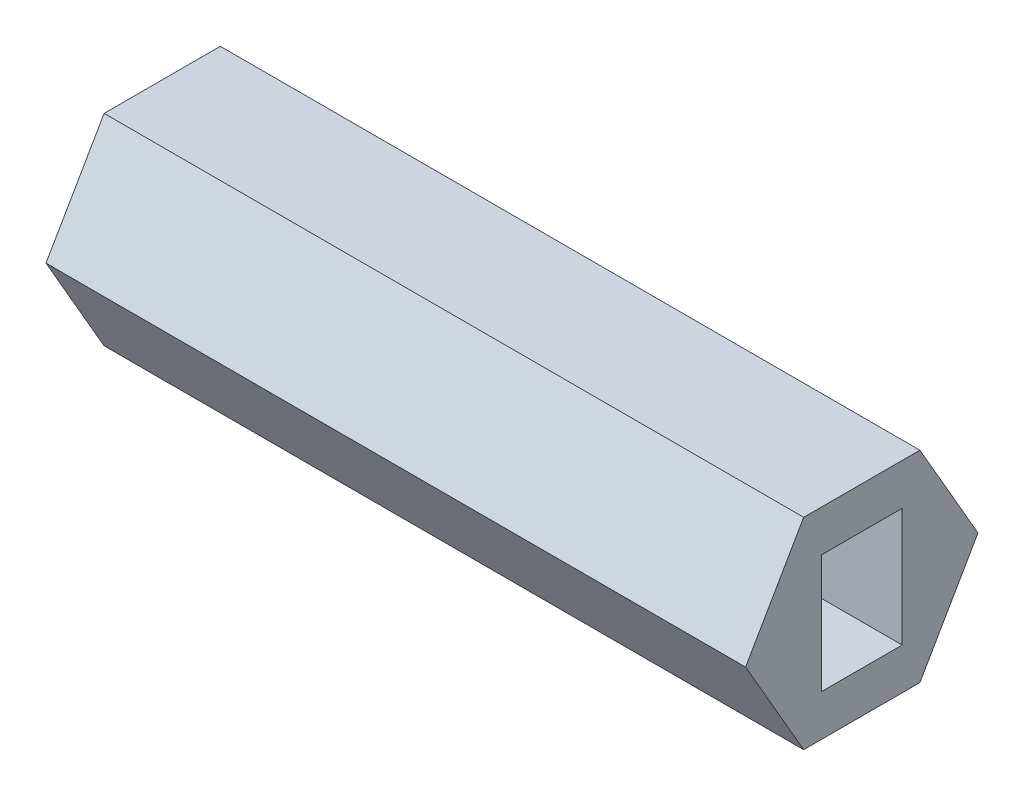
ISO-10303-21;
HEADER;
FILE_DESCRIPTION(('STEP AP214'),'2;1');
FILE_NAME('part.step','',(''),(''),'','','');
FILE_SCHEMA(('AUTOMOTIVE_DESIGN { 1 0 10303 214 1 1 1 1 }'));
ENDSEC;
DATA;
#1=APPLICATION_CONTEXT('core data for automotive mechanical design processes');
#2=APPLICATION_PROTOCOL_DEFINITION('international standard','automotive_design',2000,#1);
#3=PRODUCT_CONTEXT('',#1,'mechanical');
#4=PRODUCT('Part','Part','',(#3));
#5=PRODUCT_RELATED_PRODUCT_CATEGORY('part','',(#4));
#6=PRODUCT_DEFINITION_FORMATION('','',#4);
#7=PRODUCT_DEFINITION_CONTEXT('part definition',#1,'design');
#8=PRODUCT_DEFINITION('design','',#6,#7);
#9=PRODUCT_DEFINITION_SHAPE('','',#8);
#10=(LENGTH_UNIT() NAMED_UNIT(*) SI_UNIT(.MILLI.,.METRE.));
#11=(NAMED_UNIT(*) PLANE_ANGLE_UNIT() SI_UNIT($,.RADIAN.));
#12=(NAMED_UNIT(*) SI_UNIT($,.STERADIAN.) SOLID_ANGLE_UNIT());
#13=UNCERTAINTY_MEASURE_WITH_UNIT(LENGTH_MEASURE(1.E-05),#10,'distance_accuracy_value','');
#14=(GEOMETRIC_REPRESENTATION_CONTEXT(3) GLOBAL_UNCERTAINTY_ASSIGNED_CONTEXT((#13)) GLOBAL_UNIT_ASSIGNED_CONTEXT((#10,
#11,#12)) REPRESENTATION_CONTEXT('',''));
#15=CARTESIAN_POINT('',(0.,0.,0.));
#16=DIRECTION('',(0.,0.,1.));
#17=DIRECTION('',(1.,0.,0.));
#18=AXIS2_PLACEMENT_3D('',#15,#16,#17);
#19=CARTESIAN_POINT('',(33.02,0.,0.));
#20=DIRECTION('',(1.,0.,0.));
#21=DIRECTION('',(0.,0.,-1.));
#22=AXIS2_PLACEMENT_3D('',#19,#20,#21);
#23=PLANE('',#22);
#24=DIRECTION('',(0.,0.,1.));
#25=VECTOR('',#24,1.);
#26=CARTESIAN_POINT('',(33.02,4.75,-2.74241377865072));
#27=LINE('',#26,#25);
#28=CARTESIAN_POINT('',(33.02,4.75,-2.74241377865072));
#29=VERTEX_POINT('',#28);
#30=CARTESIAN_POINT('',(33.02,4.75,2.74241377865072));
#31=VERTEX_POINT('',#30);
#32=EDGE_CURVE('E165',#29,#31,#27,.T.);
#33=ORIENTED_EDGE('',*,*,#32,.T.);
#34=DIRECTION('',(0.,-0.866025403784438,0.5));
#35=VECTOR('',#34,1.);
#36=CARTESIAN_POINT('',(33.02,4.75,2.74241377865072));
#37=LINE('',#36,#35);
#38=CARTESIAN_POINT('',(33.02,0.,5.48482755730145));
#39=VERTEX_POINT('',#38);
#40=EDGE_CURVE('E169',#31,#39,#37,.T.);
#41=ORIENTED_EDGE('',*,*,#40,.T.);
#42=DIRECTION('',(0.,-0.866025403784439,-0.5));
#43=VECTOR('',#42,1.);
#44=CARTESIAN_POINT('',(33.02,0.,5.48482755730145));
#45=LINE('',#44,#43);
#46=CARTESIAN_POINT('',(33.02,-4.75,2.74241377865072));
#47=VERTEX_POINT('',#46);
#48=EDGE_CURVE('E173',#39,#47,#45,.T.);
#49=ORIENTED_EDGE('',*,*,#48,.T.);
#50=DIRECTION('',(0.,0.,-1.));
#51=VECTOR('',#50,1.);
#52=CARTESIAN_POINT('',(33.02,-4.75,2.74241377865072));
#53=LINE('',#52,#51);
#54=CARTESIAN_POINT('',(33.02,-4.75,-2.74241377865072));
#55=VERTEX_POINT('',#54);
#56=EDGE_CURVE('E176',#47,#55,#53,.T.);
#57=ORIENTED_EDGE('',*,*,#56,.T.);
#58=DIRECTION('',(0.,0.866025403784438,-0.5));
#59=VECTOR('',#58,1.);
#60=CARTESIAN_POINT('',(33.02,-4.75,-2.74241377865072));
#61=LINE('',#60,#59);
#62=CARTESIAN_POINT('',(33.02,0.,-5.48482755730144));
#63=VERTEX_POINT('',#62);
#64=EDGE_CURVE('E179',#55,#63,#61,.T.);
#65=ORIENTED_EDGE('',*,*,#64,.T.);
#66=DIRECTION('',(0.,0.866025403784439,0.5));
#67=VECTOR('',#66,1.);
#68=CARTESIAN_POINT('',(33.02,0.,-5.48482755730144));
#69=LINE('',#68,#67);
#70=EDGE_CURVE('E182',#63,#29,#69,.T.);
#71=ORIENTED_EDGE('',*,*,#70,.T.);
#72=EDGE_LOOP('',(#33,#41,#49,#57,#65,#71));
#73=FACE_BOUND('',#72,.T.);
#74=DIRECTION('',(0.,0.,-1.));
#75=VECTOR('',#74,1.);
#76=CARTESIAN_POINT('',(33.02,-2.794,-1.905));
#77=LINE('',#76,#75);
#78=CARTESIAN_POINT('',(33.02,-2.794,1.905));
#79=VERTEX_POINT('',#78);
#80=CARTESIAN_POINT('',(33.02,-2.794,-1.905));
#81=VERTEX_POINT('',#80);
#82=EDGE_CURVE('E126',#79,#81,#77,.T.);
#83=ORIENTED_EDGE('',*,*,#82,.F.);
#84=DIRECTION('',(0.,-1.,0.));
#85=VECTOR('',#84,1.);
#86=CARTESIAN_POINT('',(33.02,-2.794,1.905));
#87=LINE('',#86,#85);
#88=CARTESIAN_POINT('',(33.02,2.794,1.905));
#89=VERTEX_POINT('',#88);
#90=EDGE_CURVE('E117',#89,#79,#87,.T.);
#91=ORIENTED_EDGE('',*,*,#90,.F.);
#92=DIRECTION('',(0.,0.,1.));
#93=VECTOR('',#92,1.);
#94=CARTESIAN_POINT('',(33.02,2.794,-1.905));
#95=LINE('',#94,#93);
#96=CARTESIAN_POINT('',(33.02,2.794,-1.905));
#97=VERTEX_POINT('',#96);
#98=EDGE_CURVE('E143',#97,#89,#95,.T.);
#99=ORIENTED_EDGE('',*,*,#98,.F.);
#100=DIRECTION('',(0.,1.,0.));
#101=VECTOR('',#100,1.);
#102=CARTESIAN_POINT('',(33.02,-2.794,-1.905));
#103=LINE('',#102,#101);
#104=EDGE_CURVE('E139',#81,#97,#103,.T.);
#105=ORIENTED_EDGE('',*,*,#104,.F.);
#106=EDGE_LOOP('',(#83,#91,#99,#105));
#107=FACE_BOUND('',#106,.T.);
#108=ADVANCED_FACE('F39',(#73,#107),#23,.T.);
#109=CARTESIAN_POINT('',(0.,0.,0.));
#110=DIRECTION('',(1.,0.,0.));
#111=DIRECTION('',(0.,0.,-1.));
#112=AXIS2_PLACEMENT_3D('',#109,#110,#111);
#113=PLANE('',#112);
#114=DIRECTION('',(0.,0.,1.));
#115=VECTOR('',#114,1.);
#116=CARTESIAN_POINT('',(0.,4.75,-2.74241377865072));
#117=LINE('',#116,#115);
#118=CARTESIAN_POINT('',(0.,4.75,-2.74241377865072));
#119=VERTEX_POINT('',#118);
#120=CARTESIAN_POINT('',(0.,4.75,2.74241377865072));
#121=VERTEX_POINT('',#120);
#122=EDGE_CURVE('E135',#119,#121,#117,.T.);
#123=ORIENTED_EDGE('',*,*,#122,.F.);
#124=DIRECTION('',(0.,0.866025403784439,0.5));
#125=VECTOR('',#124,1.);
#126=CARTESIAN_POINT('',(0.,0.,-5.48482755730144));
#127=LINE('',#126,#125);
#128=CARTESIAN_POINT('',(0.,0.,-5.48482755730144));
#129=VERTEX_POINT('',#128);
#130=EDGE_CURVE('E170',#129,#119,#127,.T.);
#131=ORIENTED_EDGE('',*,*,#130,.F.);
#132=DIRECTION('',(0.,0.866025403784438,-0.5));
#133=VECTOR('',#132,1.);
#134=CARTESIAN_POINT('',(0.,-4.75,-2.74241377865072));
#135=LINE('',#134,#133);
#136=CARTESIAN_POINT('',(0.,-4.75,-2.74241377865072));
#137=VERTEX_POINT('',#136);
#138=EDGE_CURVE('E198',#137,#129,#135,.T.);
#139=ORIENTED_EDGE('',*,*,#138,.F.);
#140=DIRECTION('',(0.,0.,-1.));
#141=VECTOR('',#140,1.);
#142=CARTESIAN_POINT('',(0.,-4.75,2.74241377865072));
#143=LINE('',#142,#141);
#144=CARTESIAN_POINT('',(0.,-4.75,2.74241377865072));
#145=VERTEX_POINT('',#144);
#146=EDGE_CURVE('E195',#145,#137,#143,.T.);
#147=ORIENTED_EDGE('',*,*,#146,.F.);
#148=DIRECTION('',(0.,-0.866025403784439,-0.5));
#149=VECTOR('',#148,1.);
#150=CARTESIAN_POINT('',(0.,0.,5.48482755730145));
#151=LINE('',#150,#149);
#152=CARTESIAN_POINT('',(0.,0.,5.48482755730145));
#153=VERTEX_POINT('',#152);
#154=EDGE_CURVE('E192',#153,#145,#151,.T.);
#155=ORIENTED_EDGE('',*,*,#154,.F.);
#156=DIRECTION('',(0.,-0.866025403784438,0.5));
#157=VECTOR('',#156,1.);
#158=CARTESIAN_POINT('',(0.,4.75,2.74241377865072));
#159=LINE('',#158,#157);
#160=EDGE_CURVE('E189',#121,#153,#159,.T.);
#161=ORIENTED_EDGE('',*,*,#160,.F.);
#162=EDGE_LOOP('',(#123,#131,#139,#147,#155,#161));
#163=FACE_BOUND('',#162,.T.);
#164=DIRECTION('',(0.,-1.,0.));
#165=VECTOR('',#164,1.);
#166=CARTESIAN_POINT('',(0.,-2.794,1.905));
#167=LINE('',#166,#165);
#168=CARTESIAN_POINT('',(0.,2.794,1.905));
#169=VERTEX_POINT('',#168);
#170=CARTESIAN_POINT('',(0.,-2.794,1.905));
#171=VERTEX_POINT('',#170);
#172=EDGE_CURVE('E63',#169,#171,#167,.T.);
#173=ORIENTED_EDGE('',*,*,#172,.T.);
#174=DIRECTION('',(0.,0.,-1.));
#175=VECTOR('',#174,1.);
#176=CARTESIAN_POINT('',(0.,-2.794,-1.905));
#177=LINE('',#176,#175);
#178=CARTESIAN_POINT('',(0.,-2.794,-1.905));
#179=VERTEX_POINT('',#178);
#180=EDGE_CURVE('E133',#171,#179,#177,.T.);
#181=ORIENTED_EDGE('',*,*,#180,.T.);
#182=DIRECTION('',(0.,1.,0.));
#183=VECTOR('',#182,1.);
#184=CARTESIAN_POINT('',(0.,-2.794,-1.905));
#185=LINE('',#184,#183);
#186=CARTESIAN_POINT('',(0.,2.794,-1.905));
#187=VERTEX_POINT('',#186);
#188=EDGE_CURVE('E152',#179,#187,#185,.T.);
#189=ORIENTED_EDGE('',*,*,#188,.T.);
#190=DIRECTION('',(0.,0.,1.));
#191=VECTOR('',#190,1.);
#192=CARTESIAN_POINT('',(0.,2.794,-1.905));
#193=LINE('',#192,#191);
#194=EDGE_CURVE('E127',#187,#169,#193,.T.);
#195=ORIENTED_EDGE('',*,*,#194,.T.);
#196=EDGE_LOOP('',(#173,#181,#189,#195));
#197=FACE_BOUND('',#196,.T.);
#198=ADVANCED_FACE('F229',(#163,#197),#113,.F.);
#199=CARTESIAN_POINT('',(33.02,4.75,-2.74241377865072));
#200=DIRECTION('',(0.,-1.,0.));
#201=DIRECTION('',(0.,0.,-1.));
#202=AXIS2_PLACEMENT_3D('',#199,#200,#201);
#203=PLANE('',#202);
#204=ORIENTED_EDGE('',*,*,#122,.T.);
#205=DIRECTION('',(-1.,0.,0.));
#206=VECTOR('',#205,1.);
#207=CARTESIAN_POINT('',(33.02,4.75,2.74241377865072));
#208=LINE('',#207,#206);
#209=EDGE_CURVE('E11',#31,#121,#208,.T.);
#210=ORIENTED_EDGE('',*,*,#209,.F.);
#211=ORIENTED_EDGE('',*,*,#32,.F.);
#212=DIRECTION('',(-1.,0.,0.));
#213=VECTOR('',#212,1.);
#214=CARTESIAN_POINT('',(33.02,4.75,-2.74241377865072));
#215=LINE('',#214,#213);
#216=EDGE_CURVE('E185',#29,#119,#215,.T.);
#217=ORIENTED_EDGE('',*,*,#216,.T.);
#218=EDGE_LOOP('',(#204,#210,#211,#217));
#219=FACE_BOUND('',#218,.T.);
#220=ADVANCED_FACE('F41',(#219),#203,.F.);
#221=CARTESIAN_POINT('',(33.02,4.75,2.74241377865072));
#222=DIRECTION('',(0.,-0.5,-0.866025403784438));
#223=DIRECTION('',(0.,0.866025403784439,-0.5));
#224=AXIS2_PLACEMENT_3D('',#221,#222,#223);
#225=PLANE('',#224);
#226=ORIENTED_EDGE('',*,*,#160,.T.);
#227=DIRECTION('',(-1.,0.,0.));
#228=VECTOR('',#227,1.);
#229=CARTESIAN_POINT('',(33.02,0.,5.48482755730145));
#230=LINE('',#229,#228);
#231=EDGE_CURVE('E48',#39,#153,#230,.T.);
#232=ORIENTED_EDGE('',*,*,#231,.F.);
#233=ORIENTED_EDGE('',*,*,#40,.F.);
#234=ORIENTED_EDGE('',*,*,#209,.T.);
#235=EDGE_LOOP('',(#226,#232,#233,#234));
#236=FACE_BOUND('',#235,.T.);
#237=ADVANCED_FACE('F246',(#236),#225,.F.);
#238=CARTESIAN_POINT('',(33.02,0.,5.48482755730145));
#239=DIRECTION('',(0.,0.5,-0.866025403784439));
#240=DIRECTION('',(0.,0.866025403784439,0.5));
#241=AXIS2_PLACEMENT_3D('',#238,#239,#240);
#242=PLANE('',#241);
#243=ORIENTED_EDGE('',*,*,#154,.T.);
#244=DIRECTION('',(-1.,0.,0.));
#245=VECTOR('',#244,1.);
#246=CARTESIAN_POINT('',(33.02,-4.75,2.74241377865072));
#247=LINE('',#246,#245);
#248=EDGE_CURVE('E214',#47,#145,#247,.T.);
#249=ORIENTED_EDGE('',*,*,#248,.F.);
#250=ORIENTED_EDGE('',*,*,#48,.F.);
#251=ORIENTED_EDGE('',*,*,#231,.T.);
#252=EDGE_LOOP('',(#243,#249,#250,#251));
#253=FACE_BOUND('',#252,.T.);
#254=ADVANCED_FACE('F223',(#253),#242,.F.);
#255=CARTESIAN_POINT('',(33.02,-4.75,2.74241377865072));
#256=DIRECTION('',(0.,1.,0.));
#257=DIRECTION('',(0.,0.,1.));
#258=AXIS2_PLACEMENT_3D('',#255,#256,#257);
#259=PLANE('',#258);
#260=ORIENTED_EDGE('',*,*,#146,.T.);
#261=DIRECTION('',(-1.,0.,0.));
#262=VECTOR('',#261,1.);
#263=CARTESIAN_POINT('',(33.02,-4.75,-2.74241377865072));
#264=LINE('',#263,#262);
#265=EDGE_CURVE('E210',#55,#137,#264,.T.);
#266=ORIENTED_EDGE('',*,*,#265,.F.);
#267=ORIENTED_EDGE('',*,*,#56,.F.);
#268=ORIENTED_EDGE('',*,*,#248,.T.);
#269=EDGE_LOOP('',(#260,#266,#267,#268));
#270=FACE_BOUND('',#269,.T.);
#271=ADVANCED_FACE('F235',(#270),#259,.F.);
#272=CARTESIAN_POINT('',(33.02,-4.75,-2.74241377865072));
#273=DIRECTION('',(0.,0.5,0.866025403784438));
#274=DIRECTION('',(0.,-0.866025403784439,0.5));
#275=AXIS2_PLACEMENT_3D('',#272,#273,#274);
#276=PLANE('',#275);
#277=ORIENTED_EDGE('',*,*,#138,.T.);
#278=DIRECTION('',(-1.,0.,0.));
#279=VECTOR('',#278,1.);
#280=CARTESIAN_POINT('',(33.02,0.,-5.48482755730144));
#281=LINE('',#280,#279);
#282=EDGE_CURVE('E206',#63,#129,#281,.T.);
#283=ORIENTED_EDGE('',*,*,#282,.F.);
#284=ORIENTED_EDGE('',*,*,#64,.F.);
#285=ORIENTED_EDGE('',*,*,#265,.T.);
#286=EDGE_LOOP('',(#277,#283,#284,#285));
#287=FACE_BOUND('',#286,.T.);
#288=ADVANCED_FACE('F239',(#287),#276,.F.);
#289=CARTESIAN_POINT('',(33.02,0.,-5.48482755730144));
#290=DIRECTION('',(0.,-0.5,0.866025403784439));
#291=DIRECTION('',(0.,-0.866025403784439,-0.5));
#292=AXIS2_PLACEMENT_3D('',#289,#290,#291);
#293=PLANE('',#292);
#294=ORIENTED_EDGE('',*,*,#130,.T.);
#295=ORIENTED_EDGE('',*,*,#216,.F.);
#296=ORIENTED_EDGE('',*,*,#70,.F.);
#297=ORIENTED_EDGE('',*,*,#282,.T.);
#298=EDGE_LOOP('',(#294,#295,#296,#297));
#299=FACE_BOUND('',#298,.T.);
#300=ADVANCED_FACE('F249',(#299),#293,.F.);
#301=CARTESIAN_POINT('',(33.02,-2.794,1.905));
#302=DIRECTION('',(0.,0.,-1.));
#303=DIRECTION('',(-1.,0.,0.));
#304=AXIS2_PLACEMENT_3D('',#301,#302,#303);
#305=PLANE('',#304);
#306=ORIENTED_EDGE('',*,*,#172,.F.);
#307=DIRECTION('',(-1.,0.,0.));
#308=VECTOR('',#307,1.);
#309=CARTESIAN_POINT('',(33.02,2.794,1.905));
#310=LINE('',#309,#308);
#311=EDGE_CURVE('E121',#89,#169,#310,.T.);
#312=ORIENTED_EDGE('',*,*,#311,.F.);
#313=ORIENTED_EDGE('',*,*,#90,.T.);
#314=DIRECTION('',(-1.,0.,0.));
#315=VECTOR('',#314,1.);
#316=CARTESIAN_POINT('',(33.02,-2.794,1.905));
#317=LINE('',#316,#315);
#318=EDGE_CURVE('E120',#79,#171,#317,.T.);
#319=ORIENTED_EDGE('',*,*,#318,.T.);
#320=EDGE_LOOP('',(#306,#312,#313,#319));
#321=FACE_BOUND('',#320,.T.);
#322=ADVANCED_FACE('F119',(#321),#305,.T.);
#323=CARTESIAN_POINT('',(33.02,-2.794,-1.905));
#324=DIRECTION('',(0.,1.,0.));
#325=DIRECTION('',(0.,0.,1.));
#326=AXIS2_PLACEMENT_3D('',#323,#324,#325);
#327=PLANE('',#326);
#328=ORIENTED_EDGE('',*,*,#180,.F.);
#329=ORIENTED_EDGE('',*,*,#318,.F.);
#330=ORIENTED_EDGE('',*,*,#82,.T.);
#331=DIRECTION('',(-1.,0.,0.));
#332=VECTOR('',#331,1.);
#333=CARTESIAN_POINT('',(33.02,-2.794,-1.905));
#334=LINE('',#333,#332);
#335=EDGE_CURVE('E136',#81,#179,#334,.T.);
#336=ORIENTED_EDGE('',*,*,#335,.T.);
#337=EDGE_LOOP('',(#328,#329,#330,#336));
#338=FACE_BOUND('',#337,.T.);
#339=ADVANCED_FACE('F130',(#338),#327,.T.);
#340=CARTESIAN_POINT('',(33.02,-2.794,-1.905));
#341=DIRECTION('',(0.,0.,1.));
#342=DIRECTION('',(1.,0.,0.));
#343=AXIS2_PLACEMENT_3D('',#340,#341,#342);
#344=PLANE('',#343);
#345=ORIENTED_EDGE('',*,*,#188,.F.);
#346=ORIENTED_EDGE('',*,*,#335,.F.);
#347=ORIENTED_EDGE('',*,*,#104,.T.);
#348=DIRECTION('',(-1.,0.,0.));
#349=VECTOR('',#348,1.);
#350=CARTESIAN_POINT('',(33.02,2.794,-1.905));
#351=LINE('',#350,#349);
#352=EDGE_CURVE('E55',#97,#187,#351,.T.);
#353=ORIENTED_EDGE('',*,*,#352,.T.);
#354=EDGE_LOOP('',(#345,#346,#347,#353));
#355=FACE_BOUND('',#354,.T.);
#356=ADVANCED_FACE('F267',(#355),#344,.T.);
#357=CARTESIAN_POINT('',(33.02,2.794,-1.905));
#358=DIRECTION('',(0.,-1.,0.));
#359=DIRECTION('',(0.,0.,-1.));
#360=AXIS2_PLACEMENT_3D('',#357,#358,#359);
#361=PLANE('',#360);
#362=ORIENTED_EDGE('',*,*,#194,.F.);
#363=ORIENTED_EDGE('',*,*,#352,.F.);
#364=ORIENTED_EDGE('',*,*,#98,.T.);
#365=ORIENTED_EDGE('',*,*,#311,.T.);
#366=EDGE_LOOP('',(#362,#363,#364,#365));
#367=FACE_BOUND('',#366,.T.);
#368=ADVANCED_FACE('F270',(#367),#361,.T.);
#369=CLOSED_SHELL('',(#108,#198,#220,#237,#254,#271,#288,#300,#322,#339,#356,#368));
#370=MANIFOLD_SOLID_BREP('B2',#369);
#371=ADVANCED_BREP_SHAPE_REPRESENTATION('',(#18,#370),#14);
#372=SHAPE_DEFINITION_REPRESENTATION(#9,#371);
ENDSEC;
END-ISO-10303-21;
